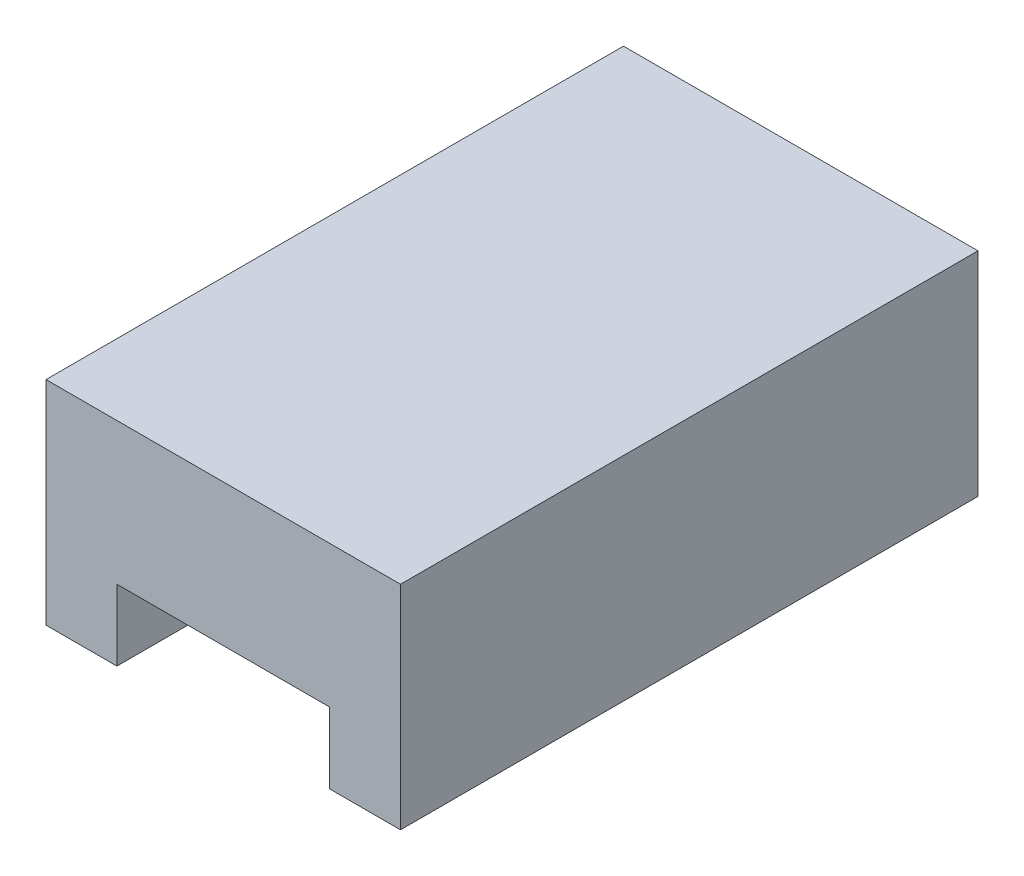
ISO-10303-21;
HEADER;
FILE_DESCRIPTION(('STEP AP214'),'2;1');
FILE_NAME('part.step','',(''),(''),'','','');
FILE_SCHEMA(('AUTOMOTIVE_DESIGN { 1 0 10303 214 1 1 1 1 }'));
ENDSEC;
DATA;
#1=APPLICATION_CONTEXT('core data for automotive mechanical design processes');
#2=APPLICATION_PROTOCOL_DEFINITION('international standard','automotive_design',2000,#1);
#3=PRODUCT_CONTEXT('',#1,'mechanical');
#4=PRODUCT('Part','Part','',(#3));
#5=PRODUCT_RELATED_PRODUCT_CATEGORY('part','',(#4));
#6=PRODUCT_DEFINITION_FORMATION('','',#4);
#7=PRODUCT_DEFINITION_CONTEXT('part definition',#1,'design');
#8=PRODUCT_DEFINITION('design','',#6,#7);
#9=PRODUCT_DEFINITION_SHAPE('','',#8);
#10=(LENGTH_UNIT() NAMED_UNIT(*) SI_UNIT(.MILLI.,.METRE.));
#11=(NAMED_UNIT(*) PLANE_ANGLE_UNIT() SI_UNIT($,.RADIAN.));
#12=(NAMED_UNIT(*) SI_UNIT($,.STERADIAN.) SOLID_ANGLE_UNIT());
#13=UNCERTAINTY_MEASURE_WITH_UNIT(LENGTH_MEASURE(1.E-05),#10,'distance_accuracy_value','');
#14=(GEOMETRIC_REPRESENTATION_CONTEXT(3) GLOBAL_UNCERTAINTY_ASSIGNED_CONTEXT((#13)) GLOBAL_UNIT_ASSIGNED_CONTEXT((#10,
#11,#12)) REPRESENTATION_CONTEXT('',''));
#15=CARTESIAN_POINT('',(0.,0.,0.));
#16=DIRECTION('',(0.,0.,1.));
#17=DIRECTION('',(1.,0.,0.));
#18=AXIS2_PLACEMENT_3D('',#15,#16,#17);
#19=CARTESIAN_POINT('',(0.,304.8,827.532));
#20=DIRECTION('',(1.,0.,0.));
#21=DIRECTION('',(0.,1.,0.));
#22=AXIS2_PLACEMENT_3D('',#19,#20,#21);
#23=PLANE('',#22);
#24=DIRECTION('',(0.,-1.,0.));
#25=VECTOR('',#24,1.);
#26=CARTESIAN_POINT('',(0.,304.8,0.));
#27=LINE('',#26,#25);
#28=CARTESIAN_POINT('',(0.,304.8,0.));
#29=VERTEX_POINT('',#28);
#30=CARTESIAN_POINT('',(0.,0.,0.));
#31=VERTEX_POINT('',#30);
#32=EDGE_CURVE('E133',#29,#31,#27,.T.);
#33=ORIENTED_EDGE('',*,*,#32,.T.);
#34=DIRECTION('',(0.,0.,-1.));
#35=VECTOR('',#34,1.);
#36=CARTESIAN_POINT('',(0.,0.,827.532));
#37=LINE('',#36,#35);
#38=CARTESIAN_POINT('',(0.,0.,827.532));
#39=VERTEX_POINT('',#38);
#40=EDGE_CURVE('E11',#39,#31,#37,.T.);
#41=ORIENTED_EDGE('',*,*,#40,.F.);
#42=DIRECTION('',(0.,-1.,0.));
#43=VECTOR('',#42,1.);
#44=CARTESIAN_POINT('',(0.,304.8,827.532));
#45=LINE('',#44,#43);
#46=CARTESIAN_POINT('',(0.,304.8,827.532));
#47=VERTEX_POINT('',#46);
#48=EDGE_CURVE('E147',#47,#39,#45,.T.);
#49=ORIENTED_EDGE('',*,*,#48,.F.);
#50=DIRECTION('',(0.,0.,-1.));
#51=VECTOR('',#50,1.);
#52=CARTESIAN_POINT('',(0.,304.8,827.532));
#53=LINE('',#52,#51);
#54=EDGE_CURVE('E129',#47,#29,#53,.T.);
#55=ORIENTED_EDGE('',*,*,#54,.T.);
#56=EDGE_LOOP('',(#33,#41,#49,#55));
#57=FACE_BOUND('',#56,.T.);
#58=ADVANCED_FACE('F37',(#57),#23,.F.);
#59=CARTESIAN_POINT('',(0.,0.,827.532));
#60=DIRECTION('',(0.,1.,0.));
#61=DIRECTION('',(0.,0.,1.));
#62=AXIS2_PLACEMENT_3D('',#59,#60,#61);
#63=PLANE('',#62);
#64=DIRECTION('',(1.,0.,0.));
#65=VECTOR('',#64,1.);
#66=CARTESIAN_POINT('',(0.,0.,0.));
#67=LINE('',#66,#65);
#68=CARTESIAN_POINT('',(101.6,0.,0.));
#69=VERTEX_POINT('',#68);
#70=EDGE_CURVE('E136',#31,#69,#67,.T.);
#71=ORIENTED_EDGE('',*,*,#70,.T.);
#72=DIRECTION('',(0.,0.,-1.));
#73=VECTOR('',#72,1.);
#74=CARTESIAN_POINT('',(101.6,0.,827.532));
#75=LINE('',#74,#73);
#76=CARTESIAN_POINT('',(101.6,0.,827.532));
#77=VERTEX_POINT('',#76);
#78=EDGE_CURVE('E45',#77,#69,#75,.T.);
#79=ORIENTED_EDGE('',*,*,#78,.F.);
#80=DIRECTION('',(1.,0.,0.));
#81=VECTOR('',#80,1.);
#82=CARTESIAN_POINT('',(0.,0.,827.532));
#83=LINE('',#82,#81);
#84=EDGE_CURVE('E96',#39,#77,#83,.T.);
#85=ORIENTED_EDGE('',*,*,#84,.F.);
#86=ORIENTED_EDGE('',*,*,#40,.T.);
#87=EDGE_LOOP('',(#71,#79,#85,#86));
#88=FACE_BOUND('',#87,.T.);
#89=ADVANCED_FACE('F182',(#88),#63,.F.);
#90=CARTESIAN_POINT('',(101.6,0.,827.532));
#91=DIRECTION('',(-1.,0.,0.));
#92=DIRECTION('',(0.,0.,1.));
#93=AXIS2_PLACEMENT_3D('',#90,#91,#92);
#94=PLANE('',#93);
#95=DIRECTION('',(0.,1.,0.));
#96=VECTOR('',#95,1.);
#97=CARTESIAN_POINT('',(101.6,0.,0.));
#98=LINE('',#97,#96);
#99=CARTESIAN_POINT('',(101.6,101.6,0.));
#100=VERTEX_POINT('',#99);
#101=EDGE_CURVE('E138',#69,#100,#98,.T.);
#102=ORIENTED_EDGE('',*,*,#101,.T.);
#103=DIRECTION('',(0.,0.,-1.));
#104=VECTOR('',#103,1.);
#105=CARTESIAN_POINT('',(101.6,101.6,827.532));
#106=LINE('',#105,#104);
#107=CARTESIAN_POINT('',(101.6,101.6,827.532));
#108=VERTEX_POINT('',#107);
#109=EDGE_CURVE('E154',#108,#100,#106,.T.);
#110=ORIENTED_EDGE('',*,*,#109,.F.);
#111=DIRECTION('',(0.,1.,0.));
#112=VECTOR('',#111,1.);
#113=CARTESIAN_POINT('',(101.6,0.,827.532));
#114=LINE('',#113,#112);
#115=EDGE_CURVE('E162',#77,#108,#114,.T.);
#116=ORIENTED_EDGE('',*,*,#115,.F.);
#117=ORIENTED_EDGE('',*,*,#78,.T.);
#118=EDGE_LOOP('',(#102,#110,#116,#117));
#119=FACE_BOUND('',#118,.T.);
#120=ADVANCED_FACE('F160',(#119),#94,.F.);
#121=CARTESIAN_POINT('',(101.6,101.6,827.532));
#122=DIRECTION('',(0.,1.,0.));
#123=DIRECTION('',(0.,0.,1.));
#124=AXIS2_PLACEMENT_3D('',#121,#122,#123);
#125=PLANE('',#124);
#126=DIRECTION('',(1.,0.,0.));
#127=VECTOR('',#126,1.);
#128=CARTESIAN_POINT('',(101.6,101.6,0.));
#129=LINE('',#128,#127);
#130=CARTESIAN_POINT('',(406.4,101.6,0.));
#131=VERTEX_POINT('',#130);
#132=EDGE_CURVE('E140',#100,#131,#129,.T.);
#133=ORIENTED_EDGE('',*,*,#132,.T.);
#134=DIRECTION('',(0.,0.,-1.));
#135=VECTOR('',#134,1.);
#136=CARTESIAN_POINT('',(406.4,101.6,827.532));
#137=LINE('',#136,#135);
#138=CARTESIAN_POINT('',(406.4,101.6,827.532));
#139=VERTEX_POINT('',#138);
#140=EDGE_CURVE('E151',#139,#131,#137,.T.);
#141=ORIENTED_EDGE('',*,*,#140,.F.);
#142=DIRECTION('',(1.,0.,0.));
#143=VECTOR('',#142,1.);
#144=CARTESIAN_POINT('',(101.6,101.6,827.532));
#145=LINE('',#144,#143);
#146=EDGE_CURVE('E174',#108,#139,#145,.T.);
#147=ORIENTED_EDGE('',*,*,#146,.F.);
#148=ORIENTED_EDGE('',*,*,#109,.T.);
#149=EDGE_LOOP('',(#133,#141,#147,#148));
#150=FACE_BOUND('',#149,.T.);
#151=ADVANCED_FACE('F170',(#150),#125,.F.);
#152=CARTESIAN_POINT('',(406.4,101.6,827.532));
#153=DIRECTION('',(1.,0.,0.));
#154=DIRECTION('',(0.,0.,-1.));
#155=AXIS2_PLACEMENT_3D('',#152,#153,#154);
#156=PLANE('',#155);
#157=DIRECTION('',(0.,-1.,0.));
#158=VECTOR('',#157,1.);
#159=CARTESIAN_POINT('',(406.4,101.6,0.));
#160=LINE('',#159,#158);
#161=CARTESIAN_POINT('',(406.4,-3.33066907387547E-13,0.));
#162=VERTEX_POINT('',#161);
#163=EDGE_CURVE('E142',#131,#162,#160,.T.);
#164=ORIENTED_EDGE('',*,*,#163,.T.);
#165=DIRECTION('',(0.,0.,-1.));
#166=VECTOR('',#165,1.);
#167=CARTESIAN_POINT('',(406.4,-3.33066907387547E-13,827.532));
#168=LINE('',#167,#166);
#169=CARTESIAN_POINT('',(406.4,-3.33066907387547E-13,827.532));
#170=VERTEX_POINT('',#169);
#171=EDGE_CURVE('E124',#170,#162,#168,.T.);
#172=ORIENTED_EDGE('',*,*,#171,.F.);
#173=DIRECTION('',(0.,-1.,0.));
#174=VECTOR('',#173,1.);
#175=CARTESIAN_POINT('',(406.4,101.6,827.532));
#176=LINE('',#175,#174);
#177=EDGE_CURVE('E115',#139,#170,#176,.T.);
#178=ORIENTED_EDGE('',*,*,#177,.F.);
#179=ORIENTED_EDGE('',*,*,#140,.T.);
#180=EDGE_LOOP('',(#164,#172,#178,#179));
#181=FACE_BOUND('',#180,.T.);
#182=ADVANCED_FACE('F173',(#181),#156,.F.);
#183=CARTESIAN_POINT('',(406.4,-3.33066907387547E-13,827.532));
#184=DIRECTION('',(0.,1.,0.));
#185=DIRECTION('',(-1.,0.,0.));
#186=AXIS2_PLACEMENT_3D('',#183,#184,#185);
#187=PLANE('',#186);
#188=DIRECTION('',(1.,0.,0.));
#189=VECTOR('',#188,1.);
#190=CARTESIAN_POINT('',(406.4,-3.33066907387547E-13,0.));
#191=LINE('',#190,#189);
#192=CARTESIAN_POINT('',(508.,0.,0.));
#193=VERTEX_POINT('',#192);
#194=EDGE_CURVE('E123',#162,#193,#191,.T.);
#195=ORIENTED_EDGE('',*,*,#194,.T.);
#196=DIRECTION('',(0.,0.,-1.));
#197=VECTOR('',#196,1.);
#198=CARTESIAN_POINT('',(508.,0.,827.532));
#199=LINE('',#198,#197);
#200=CARTESIAN_POINT('',(508.,0.,827.532));
#201=VERTEX_POINT('',#200);
#202=EDGE_CURVE('E120',#201,#193,#199,.T.);
#203=ORIENTED_EDGE('',*,*,#202,.F.);
#204=DIRECTION('',(1.,0.,0.));
#205=VECTOR('',#204,1.);
#206=CARTESIAN_POINT('',(406.4,-3.33066907387547E-13,827.532));
#207=LINE('',#206,#205);
#208=EDGE_CURVE('E109',#170,#201,#207,.T.);
#209=ORIENTED_EDGE('',*,*,#208,.F.);
#210=ORIENTED_EDGE('',*,*,#171,.T.);
#211=EDGE_LOOP('',(#195,#203,#209,#210));
#212=FACE_BOUND('',#211,.T.);
#213=ADVANCED_FACE('F121',(#212),#187,.F.);
#214=CARTESIAN_POINT('',(508.,0.,827.532));
#215=DIRECTION('',(-1.,0.,0.));
#216=DIRECTION('',(0.,0.,1.));
#217=AXIS2_PLACEMENT_3D('',#214,#215,#216);
#218=PLANE('',#217);
#219=DIRECTION('',(0.,1.,0.));
#220=VECTOR('',#219,1.);
#221=CARTESIAN_POINT('',(508.,0.,0.));
#222=LINE('',#221,#220);
#223=CARTESIAN_POINT('',(508.,304.8,0.));
#224=VERTEX_POINT('',#223);
#225=EDGE_CURVE('E82',#193,#224,#222,.T.);
#226=ORIENTED_EDGE('',*,*,#225,.T.);
#227=DIRECTION('',(0.,0.,-1.));
#228=VECTOR('',#227,1.);
#229=CARTESIAN_POINT('',(508.,304.8,827.532));
#230=LINE('',#229,#228);
#231=CARTESIAN_POINT('',(508.,304.8,827.532));
#232=VERTEX_POINT('',#231);
#233=EDGE_CURVE('E125',#232,#224,#230,.T.);
#234=ORIENTED_EDGE('',*,*,#233,.F.);
#235=DIRECTION('',(0.,1.,0.));
#236=VECTOR('',#235,1.);
#237=CARTESIAN_POINT('',(508.,0.,827.532));
#238=LINE('',#237,#236);
#239=EDGE_CURVE('E113',#201,#232,#238,.T.);
#240=ORIENTED_EDGE('',*,*,#239,.F.);
#241=ORIENTED_EDGE('',*,*,#202,.T.);
#242=EDGE_LOOP('',(#226,#234,#240,#241));
#243=FACE_BOUND('',#242,.T.);
#244=ADVANCED_FACE('F127',(#243),#218,.F.);
#245=CARTESIAN_POINT('',(508.,304.8,827.532));
#246=DIRECTION('',(0.,-1.,0.));
#247=DIRECTION('',(1.,0.,0.));
#248=AXIS2_PLACEMENT_3D('',#245,#246,#247);
#249=PLANE('',#248);
#250=DIRECTION('',(-1.,0.,0.));
#251=VECTOR('',#250,1.);
#252=CARTESIAN_POINT('',(508.,304.8,0.));
#253=LINE('',#252,#251);
#254=EDGE_CURVE('E88',#224,#29,#253,.T.);
#255=ORIENTED_EDGE('',*,*,#254,.T.);
#256=ORIENTED_EDGE('',*,*,#54,.F.);
#257=DIRECTION('',(-1.,0.,0.));
#258=VECTOR('',#257,1.);
#259=CARTESIAN_POINT('',(508.,304.8,827.532));
#260=LINE('',#259,#258);
#261=EDGE_CURVE('E53',#232,#47,#260,.T.);
#262=ORIENTED_EDGE('',*,*,#261,.F.);
#263=ORIENTED_EDGE('',*,*,#233,.T.);
#264=EDGE_LOOP('',(#255,#256,#262,#263));
#265=FACE_BOUND('',#264,.T.);
#266=ADVANCED_FACE('F198',(#265),#249,.F.);
#267=CARTESIAN_POINT('',(0.,0.,827.532));
#268=DIRECTION('',(0.,0.,1.));
#269=DIRECTION('',(1.,0.,0.));
#270=AXIS2_PLACEMENT_3D('',#267,#268,#269);
#271=PLANE('',#270);
#272=ORIENTED_EDGE('',*,*,#48,.T.);
#273=ORIENTED_EDGE('',*,*,#84,.T.);
#274=ORIENTED_EDGE('',*,*,#115,.T.);
#275=ORIENTED_EDGE('',*,*,#146,.T.);
#276=ORIENTED_EDGE('',*,*,#177,.T.);
#277=ORIENTED_EDGE('',*,*,#208,.T.);
#278=ORIENTED_EDGE('',*,*,#239,.T.);
#279=ORIENTED_EDGE('',*,*,#261,.T.);
#280=EDGE_LOOP('',(#272,#273,#274,#275,#276,#277,#278,#279));
#281=FACE_BOUND('',#280,.T.);
#282=ADVANCED_FACE('F111',(#281),#271,.T.);
#283=CARTESIAN_POINT('',(0.,0.,0.));
#284=DIRECTION('',(0.,0.,1.));
#285=DIRECTION('',(1.,0.,0.));
#286=AXIS2_PLACEMENT_3D('',#283,#284,#285);
#287=PLANE('',#286);
#288=ORIENTED_EDGE('',*,*,#32,.F.);
#289=ORIENTED_EDGE('',*,*,#254,.F.);
#290=ORIENTED_EDGE('',*,*,#225,.F.);
#291=ORIENTED_EDGE('',*,*,#194,.F.);
#292=ORIENTED_EDGE('',*,*,#163,.F.);
#293=ORIENTED_EDGE('',*,*,#132,.F.);
#294=ORIENTED_EDGE('',*,*,#101,.F.);
#295=ORIENTED_EDGE('',*,*,#70,.F.);
#296=EDGE_LOOP('',(#288,#289,#290,#291,#292,#293,#294,#295));
#297=FACE_BOUND('',#296,.T.);
#298=ADVANCED_FACE('F166',(#297),#287,.F.);
#299=CLOSED_SHELL('',(#58,#89,#120,#151,#182,#213,#244,#266,#282,#298));
#300=MANIFOLD_SOLID_BREP('B2',#299);
#301=ADVANCED_BREP_SHAPE_REPRESENTATION('',(#18,#300),#14);
#302=SHAPE_DEFINITION_REPRESENTATION(#9,#301);
ENDSEC;
END-ISO-10303-21;
